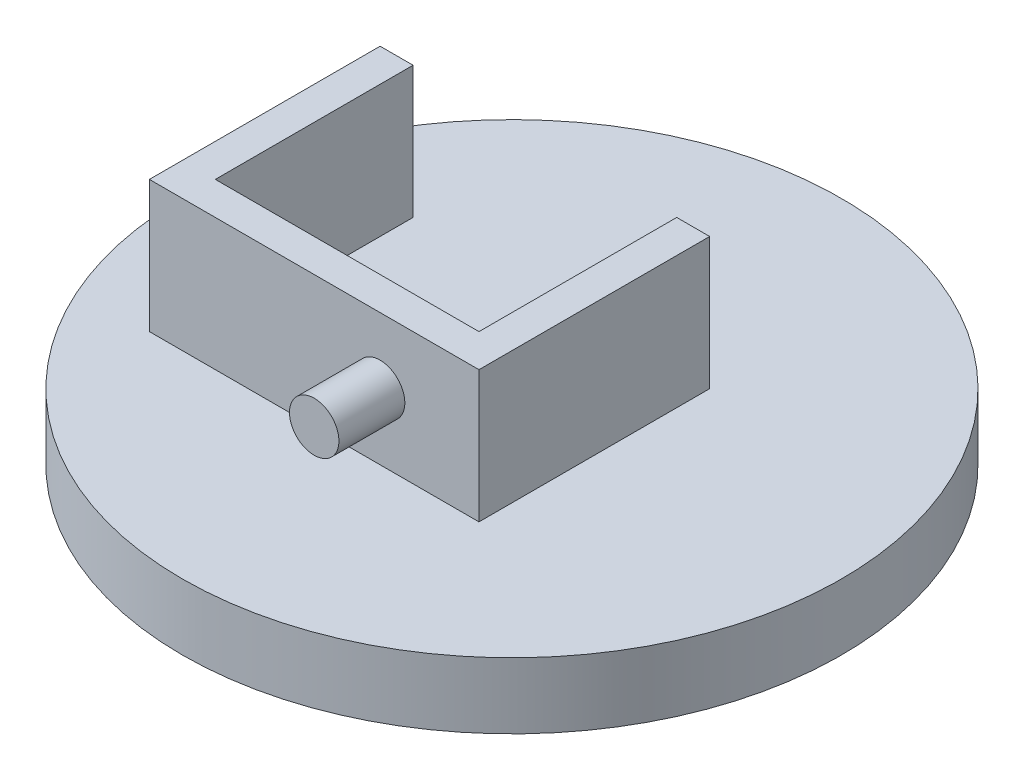
ISO-10303-21;
HEADER;
FILE_DESCRIPTION(('STEP AP214'),'2;1');
FILE_NAME('part.step','',(''),(''),'','','');
FILE_SCHEMA(('AUTOMOTIVE_DESIGN { 1 0 10303 214 1 1 1 1 }'));
ENDSEC;
DATA;
#1=APPLICATION_CONTEXT('core data for automotive mechanical design processes');
#2=APPLICATION_PROTOCOL_DEFINITION('international standard','automotive_design',2000,#1);
#3=PRODUCT_CONTEXT('',#1,'mechanical');
#4=PRODUCT('Part','Part','',(#3));
#5=PRODUCT_RELATED_PRODUCT_CATEGORY('part','',(#4));
#6=PRODUCT_DEFINITION_FORMATION('','',#4);
#7=PRODUCT_DEFINITION_CONTEXT('part definition',#1,'design');
#8=PRODUCT_DEFINITION('design','',#6,#7);
#9=PRODUCT_DEFINITION_SHAPE('','',#8);
#10=(LENGTH_UNIT() NAMED_UNIT(*) SI_UNIT(.MILLI.,.METRE.));
#11=(NAMED_UNIT(*) PLANE_ANGLE_UNIT() SI_UNIT($,.RADIAN.));
#12=(NAMED_UNIT(*) SI_UNIT($,.STERADIAN.) SOLID_ANGLE_UNIT());
#13=UNCERTAINTY_MEASURE_WITH_UNIT(LENGTH_MEASURE(1.E-05),#10,'distance_accuracy_value','');
#14=(GEOMETRIC_REPRESENTATION_CONTEXT(3) GLOBAL_UNCERTAINTY_ASSIGNED_CONTEXT((#13)) GLOBAL_UNIT_ASSIGNED_CONTEXT((#10,
#11,#12)) REPRESENTATION_CONTEXT('',''));
#15=CARTESIAN_POINT('',(0.,0.,0.));
#16=DIRECTION('',(0.,0.,1.));
#17=DIRECTION('',(1.,0.,0.));
#18=AXIS2_PLACEMENT_3D('',#15,#16,#17);
#19=CARTESIAN_POINT('',(0.,10.,0.));
#20=DIRECTION('',(0.,1.,0.));
#21=DIRECTION('',(0.,0.,1.));
#22=AXIS2_PLACEMENT_3D('',#19,#20,#21);
#23=PLANE('',#22);
#24=CARTESIAN_POINT('',(0.,10.,0.));
#25=DIRECTION('',(0.,1.,0.));
#26=DIRECTION('',(0.,0.,1.));
#27=AXIS2_PLACEMENT_3D('',#24,#25,#26);
#28=CIRCLE('',#27,5.);
#29=CARTESIAN_POINT('',(0.,10.,5.));
#30=VERTEX_POINT('',#29);
#31=EDGE_CURVE('E184',#30,#30,#28,.T.);
#32=ORIENTED_EDGE('',*,*,#31,.F.);
#33=EDGE_LOOP('',(#32));
#34=FACE_BOUND('',#33,.T.);
#35=CARTESIAN_POINT('',(0.,10.,0.));
#36=DIRECTION('',(0.,1.,0.));
#37=DIRECTION('',(0.,0.,1.));
#38=AXIS2_PLACEMENT_3D('',#35,#36,#37);
#39=CIRCLE('',#38,50.);
#40=CARTESIAN_POINT('',(0.,10.,50.));
#41=VERTEX_POINT('',#40);
#42=EDGE_CURVE('E46',#41,#41,#39,.T.);
#43=ORIENTED_EDGE('',*,*,#42,.T.);
#44=EDGE_LOOP('',(#43));
#45=FACE_BOUND('',#44,.T.);
#46=DIRECTION('',(0.,0.,1.));
#47=VECTOR('',#46,1.);
#48=CARTESIAN_POINT('',(15.,10.,-15.));
#49=LINE('',#48,#47);
#50=CARTESIAN_POINT('',(15.,10.,-15.));
#51=VERTEX_POINT('',#50);
#52=CARTESIAN_POINT('',(15.,10.,20.));
#53=VERTEX_POINT('',#52);
#54=EDGE_CURVE('E149',#51,#53,#49,.T.);
#55=ORIENTED_EDGE('',*,*,#54,.T.);
#56=DIRECTION('',(1.,0.,0.));
#57=VECTOR('',#56,1.);
#58=CARTESIAN_POINT('',(-35.,10.,20.));
#59=LINE('',#58,#57);
#60=CARTESIAN_POINT('',(-35.,10.,20.));
#61=VERTEX_POINT('',#60);
#62=EDGE_CURVE('E177',#61,#53,#59,.T.);
#63=ORIENTED_EDGE('',*,*,#62,.F.);
#64=DIRECTION('',(0.,0.,1.));
#65=VECTOR('',#64,1.);
#66=CARTESIAN_POINT('',(-35.,10.,-15.));
#67=LINE('',#66,#65);
#68=CARTESIAN_POINT('',(-35.,10.,-15.));
#69=VERTEX_POINT('',#68);
#70=EDGE_CURVE('E179',#69,#61,#67,.T.);
#71=ORIENTED_EDGE('',*,*,#70,.F.);
#72=DIRECTION('',(-1.,0.,0.));
#73=VECTOR('',#72,1.);
#74=CARTESIAN_POINT('',(-30.,10.,-15.));
#75=LINE('',#74,#73);
#76=CARTESIAN_POINT('',(-30.,10.,-15.));
#77=VERTEX_POINT('',#76);
#78=EDGE_CURVE('E169',#77,#69,#75,.T.);
#79=ORIENTED_EDGE('',*,*,#78,.F.);
#80=DIRECTION('',(0.,0.,1.));
#81=VECTOR('',#80,1.);
#82=CARTESIAN_POINT('',(-30.,10.,-15.));
#83=LINE('',#82,#81);
#84=CARTESIAN_POINT('',(-30.,10.,15.));
#85=VERTEX_POINT('',#84);
#86=EDGE_CURVE('E157',#77,#85,#83,.T.);
#87=ORIENTED_EDGE('',*,*,#86,.T.);
#88=DIRECTION('',(-1.,0.,0.));
#89=VECTOR('',#88,1.);
#90=CARTESIAN_POINT('',(10.,10.,15.));
#91=LINE('',#90,#89);
#92=CARTESIAN_POINT('',(10.,10.,15.));
#93=VERTEX_POINT('',#92);
#94=EDGE_CURVE('E139',#93,#85,#91,.T.);
#95=ORIENTED_EDGE('',*,*,#94,.F.);
#96=DIRECTION('',(0.,0.,1.));
#97=VECTOR('',#96,1.);
#98=CARTESIAN_POINT('',(9.99999999999999,10.,-15.));
#99=LINE('',#98,#97);
#100=CARTESIAN_POINT('',(9.99999999999999,10.,-15.));
#101=VERTEX_POINT('',#100);
#102=EDGE_CURVE('E154',#101,#93,#99,.T.);
#103=ORIENTED_EDGE('',*,*,#102,.F.);
#104=DIRECTION('',(1.,0.,0.));
#105=VECTOR('',#104,1.);
#106=CARTESIAN_POINT('',(9.99999999999999,10.,-15.));
#107=LINE('',#106,#105);
#108=EDGE_CURVE('E53',#101,#51,#107,.T.);
#109=ORIENTED_EDGE('',*,*,#108,.T.);
#110=EDGE_LOOP('',(#55,#63,#71,#79,#87,#95,#103,#109));
#111=FACE_BOUND('',#110,.T.);
#112=ADVANCED_FACE('F38',(#34,#45,#111),#23,.T.);
#113=CARTESIAN_POINT('',(-30.,30.,-15.));
#114=DIRECTION('',(1.,0.,0.));
#115=DIRECTION('',(0.,0.,-1.));
#116=AXIS2_PLACEMENT_3D('',#113,#114,#115);
#117=PLANE('',#116);
#118=DIRECTION('',(0.,0.,1.));
#119=VECTOR('',#118,1.);
#120=CARTESIAN_POINT('',(-30.,30.,-15.));
#121=LINE('',#120,#119);
#122=CARTESIAN_POINT('',(-30.,30.,-15.));
#123=VERTEX_POINT('',#122);
#124=CARTESIAN_POINT('',(-30.,30.,15.));
#125=VERTEX_POINT('',#124);
#126=EDGE_CURVE('E165',#123,#125,#121,.T.);
#127=ORIENTED_EDGE('',*,*,#126,.T.);
#128=DIRECTION('',(0.,1.,0.));
#129=VECTOR('',#128,1.);
#130=CARTESIAN_POINT('',(-30.,30.,15.));
#131=LINE('',#130,#129);
#132=EDGE_CURVE('E131',#85,#125,#131,.T.);
#133=ORIENTED_EDGE('',*,*,#132,.F.);
#134=ORIENTED_EDGE('',*,*,#86,.F.);
#135=DIRECTION('',(0.,-1.,0.));
#136=VECTOR('',#135,1.);
#137=CARTESIAN_POINT('',(-30.,30.,-15.));
#138=LINE('',#137,#136);
#139=EDGE_CURVE('E182',#123,#77,#138,.T.);
#140=ORIENTED_EDGE('',*,*,#139,.F.);
#141=EDGE_LOOP('',(#127,#133,#134,#140));
#142=FACE_BOUND('',#141,.T.);
#143=ADVANCED_FACE('F215',(#142),#117,.T.);
#144=CARTESIAN_POINT('',(9.99999999999999,30.,-15.));
#145=DIRECTION('',(1.,0.,0.));
#146=DIRECTION('',(0.,0.,-1.));
#147=AXIS2_PLACEMENT_3D('',#144,#145,#146);
#148=PLANE('',#147);
#149=DIRECTION('',(0.,1.,0.));
#150=VECTOR('',#149,1.);
#151=CARTESIAN_POINT('',(10.,30.,15.));
#152=LINE('',#151,#150);
#153=CARTESIAN_POINT('',(10.,30.,15.));
#154=VERTEX_POINT('',#153);
#155=EDGE_CURVE('E132',#93,#154,#152,.T.);
#156=ORIENTED_EDGE('',*,*,#155,.T.);
#157=DIRECTION('',(0.,0.,1.));
#158=VECTOR('',#157,1.);
#159=CARTESIAN_POINT('',(9.99999999999999,30.,-15.));
#160=LINE('',#159,#158);
#161=CARTESIAN_POINT('',(9.99999999999999,30.,-15.));
#162=VERTEX_POINT('',#161);
#163=EDGE_CURVE('E152',#162,#154,#160,.T.);
#164=ORIENTED_EDGE('',*,*,#163,.F.);
#165=DIRECTION('',(0.,-1.,0.));
#166=VECTOR('',#165,1.);
#167=CARTESIAN_POINT('',(9.99999999999999,30.,-15.));
#168=LINE('',#167,#166);
#169=EDGE_CURVE('E142',#162,#101,#168,.T.);
#170=ORIENTED_EDGE('',*,*,#169,.T.);
#171=ORIENTED_EDGE('',*,*,#102,.T.);
#172=EDGE_LOOP('',(#156,#164,#170,#171));
#173=FACE_BOUND('',#172,.T.);
#174=ADVANCED_FACE('F211',(#173),#148,.F.);
#175=CARTESIAN_POINT('',(0.,10.,0.));
#176=DIRECTION('',(0.,-1.,0.));
#177=DIRECTION('',(0.,0.,-1.));
#178=AXIS2_PLACEMENT_3D('',#175,#176,#177);
#179=CYLINDRICAL_SURFACE('',#178,50.);
#180=ORIENTED_EDGE('',*,*,#42,.F.);
#181=EDGE_LOOP('',(#180));
#182=FACE_BOUND('',#181,.T.);
#183=CARTESIAN_POINT('',(0.,0.,0.));
#184=DIRECTION('',(0.,1.,0.));
#185=DIRECTION('',(0.,0.,1.));
#186=AXIS2_PLACEMENT_3D('',#183,#184,#185);
#187=CIRCLE('',#186,50.);
#188=CARTESIAN_POINT('',(0.,0.,50.));
#189=VERTEX_POINT('',#188);
#190=EDGE_CURVE('E192',#189,#189,#187,.T.);
#191=ORIENTED_EDGE('',*,*,#190,.T.);
#192=EDGE_LOOP('',(#191));
#193=FACE_BOUND('',#192,.T.);
#194=ADVANCED_FACE('F40',(#182,#193),#179,.T.);
#195=CARTESIAN_POINT('',(0.,0.,0.));
#196=DIRECTION('',(0.,1.,0.));
#197=DIRECTION('',(0.,0.,1.));
#198=AXIS2_PLACEMENT_3D('',#195,#196,#197);
#199=PLANE('',#198);
#200=CARTESIAN_POINT('',(0.,0.,0.));
#201=DIRECTION('',(0.,1.,0.));
#202=DIRECTION('',(0.,0.,1.));
#203=AXIS2_PLACEMENT_3D('',#200,#201,#202);
#204=CIRCLE('',#203,5.);
#205=CARTESIAN_POINT('',(0.,0.,5.));
#206=VERTEX_POINT('',#205);
#207=EDGE_CURVE('E189',#206,#206,#204,.T.);
#208=ORIENTED_EDGE('',*,*,#207,.T.);
#209=EDGE_LOOP('',(#208));
#210=FACE_BOUND('',#209,.T.);
#211=ORIENTED_EDGE('',*,*,#190,.F.);
#212=EDGE_LOOP('',(#211));
#213=FACE_BOUND('',#212,.T.);
#214=ADVANCED_FACE('F200',(#210,#213),#199,.F.);
#215=CARTESIAN_POINT('',(0.,0.,0.));
#216=DIRECTION('',(0.,1.,0.));
#217=DIRECTION('',(0.,0.,1.));
#218=AXIS2_PLACEMENT_3D('',#215,#216,#217);
#219=CYLINDRICAL_SURFACE('',#218,5.);
#220=ORIENTED_EDGE('',*,*,#207,.F.);
#221=EDGE_LOOP('',(#220));
#222=FACE_BOUND('',#221,.T.);
#223=ORIENTED_EDGE('',*,*,#31,.T.);
#224=EDGE_LOOP('',(#223));
#225=FACE_BOUND('',#224,.T.);
#226=ADVANCED_FACE('F202',(#222,#225),#219,.F.);
#227=CARTESIAN_POINT('',(-30.,30.,-15.));
#228=DIRECTION('',(0.,0.,1.));
#229=DIRECTION('',(1.,0.,0.));
#230=AXIS2_PLACEMENT_3D('',#227,#228,#229);
#231=PLANE('',#230);
#232=ORIENTED_EDGE('',*,*,#78,.T.);
#233=DIRECTION('',(0.,-1.,0.));
#234=VECTOR('',#233,1.);
#235=CARTESIAN_POINT('',(-35.,30.,-15.));
#236=LINE('',#235,#234);
#237=CARTESIAN_POINT('',(-35.,30.,-15.));
#238=VERTEX_POINT('',#237);
#239=EDGE_CURVE('E185',#238,#69,#236,.T.);
#240=ORIENTED_EDGE('',*,*,#239,.F.);
#241=DIRECTION('',(-1.,0.,0.));
#242=VECTOR('',#241,1.);
#243=CARTESIAN_POINT('',(-30.,30.,-15.));
#244=LINE('',#243,#242);
#245=EDGE_CURVE('E173',#123,#238,#244,.T.);
#246=ORIENTED_EDGE('',*,*,#245,.F.);
#247=ORIENTED_EDGE('',*,*,#139,.T.);
#248=EDGE_LOOP('',(#232,#240,#246,#247));
#249=FACE_BOUND('',#248,.T.);
#250=ADVANCED_FACE('F208',(#249),#231,.F.);
#251=CARTESIAN_POINT('',(-35.,30.,-15.));
#252=DIRECTION('',(1.,0.,0.));
#253=DIRECTION('',(0.,0.,-1.));
#254=AXIS2_PLACEMENT_3D('',#251,#252,#253);
#255=PLANE('',#254);
#256=ORIENTED_EDGE('',*,*,#70,.T.);
#257=DIRECTION('',(0.,-1.,0.));
#258=VECTOR('',#257,1.);
#259=CARTESIAN_POINT('',(-35.,30.,20.));
#260=LINE('',#259,#258);
#261=CARTESIAN_POINT('',(-35.,30.,20.));
#262=VERTEX_POINT('',#261);
#263=EDGE_CURVE('E61',#262,#61,#260,.T.);
#264=ORIENTED_EDGE('',*,*,#263,.F.);
#265=DIRECTION('',(0.,0.,1.));
#266=VECTOR('',#265,1.);
#267=CARTESIAN_POINT('',(-35.,30.,-15.));
#268=LINE('',#267,#266);
#269=EDGE_CURVE('E171',#238,#262,#268,.T.);
#270=ORIENTED_EDGE('',*,*,#269,.F.);
#271=ORIENTED_EDGE('',*,*,#239,.T.);
#272=EDGE_LOOP('',(#256,#264,#270,#271));
#273=FACE_BOUND('',#272,.T.);
#274=ADVANCED_FACE('F229',(#273),#255,.F.);
#275=CARTESIAN_POINT('',(-35.,30.,20.));
#276=DIRECTION('',(0.,0.,-1.));
#277=DIRECTION('',(-1.,0.,0.));
#278=AXIS2_PLACEMENT_3D('',#275,#276,#277);
#279=PLANE('',#278);
#280=CARTESIAN_POINT('',(0.,20.,20.));
#281=DIRECTION('',(0.,0.,-1.));
#282=DIRECTION('',(-1.,0.,0.));
#283=AXIS2_PLACEMENT_3D('',#280,#281,#282);
#284=CIRCLE('',#283,3.75);
#285=CARTESIAN_POINT('',(-3.75,20.,20.));
#286=VERTEX_POINT('',#285);
#287=EDGE_CURVE('E11',#286,#286,#284,.F.);
#288=ORIENTED_EDGE('',*,*,#287,.F.);
#289=EDGE_LOOP('',(#288));
#290=FACE_BOUND('',#289,.T.);
#291=ORIENTED_EDGE('',*,*,#62,.T.);
#292=DIRECTION('',(0.,-1.,0.));
#293=VECTOR('',#292,1.);
#294=CARTESIAN_POINT('',(15.,30.,20.));
#295=LINE('',#294,#293);
#296=CARTESIAN_POINT('',(15.,30.,20.));
#297=VERTEX_POINT('',#296);
#298=EDGE_CURVE('E141',#297,#53,#295,.T.);
#299=ORIENTED_EDGE('',*,*,#298,.F.);
#300=DIRECTION('',(1.,0.,0.));
#301=VECTOR('',#300,1.);
#302=CARTESIAN_POINT('',(-35.,30.,20.));
#303=LINE('',#302,#301);
#304=EDGE_CURVE('E168',#262,#297,#303,.T.);
#305=ORIENTED_EDGE('',*,*,#304,.F.);
#306=ORIENTED_EDGE('',*,*,#263,.T.);
#307=EDGE_LOOP('',(#291,#299,#305,#306));
#308=FACE_BOUND('',#307,.T.);
#309=ADVANCED_FACE('F225',(#290,#308),#279,.F.);
#310=CARTESIAN_POINT('',(0.,30.,0.));
#311=DIRECTION('',(0.,1.,0.));
#312=DIRECTION('',(0.,0.,1.));
#313=AXIS2_PLACEMENT_3D('',#310,#311,#312);
#314=PLANE('',#313);
#315=ORIENTED_EDGE('',*,*,#126,.F.);
#316=ORIENTED_EDGE('',*,*,#245,.T.);
#317=ORIENTED_EDGE('',*,*,#269,.T.);
#318=ORIENTED_EDGE('',*,*,#304,.T.);
#319=DIRECTION('',(0.,0.,1.));
#320=VECTOR('',#319,1.);
#321=CARTESIAN_POINT('',(15.,30.,-15.));
#322=LINE('',#321,#320);
#323=CARTESIAN_POINT('',(15.,30.,-15.));
#324=VERTEX_POINT('',#323);
#325=EDGE_CURVE('E144',#324,#297,#322,.T.);
#326=ORIENTED_EDGE('',*,*,#325,.F.);
#327=DIRECTION('',(1.,0.,0.));
#328=VECTOR('',#327,1.);
#329=CARTESIAN_POINT('',(9.99999999999999,30.,-15.));
#330=LINE('',#329,#328);
#331=EDGE_CURVE('E160',#162,#324,#330,.T.);
#332=ORIENTED_EDGE('',*,*,#331,.F.);
#333=ORIENTED_EDGE('',*,*,#163,.T.);
#334=DIRECTION('',(-1.,0.,0.));
#335=VECTOR('',#334,1.);
#336=CARTESIAN_POINT('',(10.,30.,15.));
#337=LINE('',#336,#335);
#338=EDGE_CURVE('E135',#154,#125,#337,.T.);
#339=ORIENTED_EDGE('',*,*,#338,.T.);
#340=EDGE_LOOP('',(#315,#316,#317,#318,#326,#332,#333,#339));
#341=FACE_BOUND('',#340,.T.);
#342=ADVANCED_FACE('F228',(#341),#314,.T.);
#343=CARTESIAN_POINT('',(15.,30.,-15.));
#344=DIRECTION('',(1.,0.,0.));
#345=DIRECTION('',(0.,0.,-1.));
#346=AXIS2_PLACEMENT_3D('',#343,#344,#345);
#347=PLANE('',#346);
#348=ORIENTED_EDGE('',*,*,#54,.F.);
#349=DIRECTION('',(0.,-1.,0.));
#350=VECTOR('',#349,1.);
#351=CARTESIAN_POINT('',(15.,30.,-15.));
#352=LINE('',#351,#350);
#353=EDGE_CURVE('E145',#324,#51,#352,.T.);
#354=ORIENTED_EDGE('',*,*,#353,.F.);
#355=ORIENTED_EDGE('',*,*,#325,.T.);
#356=ORIENTED_EDGE('',*,*,#298,.T.);
#357=EDGE_LOOP('',(#348,#354,#355,#356));
#358=FACE_BOUND('',#357,.T.);
#359=ADVANCED_FACE('F239',(#358),#347,.T.);
#360=CARTESIAN_POINT('',(9.99999999999999,30.,-15.));
#361=DIRECTION('',(0.,0.,-1.));
#362=DIRECTION('',(-1.,0.,0.));
#363=AXIS2_PLACEMENT_3D('',#360,#361,#362);
#364=PLANE('',#363);
#365=CARTESIAN_POINT('',(12.5,24.8738180914245,-15.));
#366=DIRECTION('',(0.,0.,-1.));
#367=DIRECTION('',(-1.,0.,0.));
#368=AXIS2_PLACEMENT_3D('',#365,#366,#367);
#369=CIRCLE('',#368,0.999999999999989);
#370=CARTESIAN_POINT('',(11.5,24.8738180914245,-15.));
#371=VERTEX_POINT('',#370);
#372=EDGE_CURVE('E119',#371,#371,#369,.T.);
#373=ORIENTED_EDGE('',*,*,#372,.F.);
#374=EDGE_LOOP('',(#373));
#375=FACE_BOUND('',#374,.T.);
#376=CARTESIAN_POINT('',(12.5,14.8738180914245,-15.));
#377=DIRECTION('',(0.,0.,-1.));
#378=DIRECTION('',(-1.,0.,0.));
#379=AXIS2_PLACEMENT_3D('',#376,#377,#378);
#380=CIRCLE('',#379,0.999999999999989);
#381=CARTESIAN_POINT('',(11.5,14.8738180914245,-15.));
#382=VERTEX_POINT('',#381);
#383=EDGE_CURVE('E118',#382,#382,#380,.T.);
#384=ORIENTED_EDGE('',*,*,#383,.F.);
#385=EDGE_LOOP('',(#384));
#386=FACE_BOUND('',#385,.T.);
#387=ORIENTED_EDGE('',*,*,#108,.F.);
#388=ORIENTED_EDGE('',*,*,#169,.F.);
#389=ORIENTED_EDGE('',*,*,#331,.T.);
#390=ORIENTED_EDGE('',*,*,#353,.T.);
#391=EDGE_LOOP('',(#387,#388,#389,#390));
#392=FACE_BOUND('',#391,.T.);
#393=ADVANCED_FACE('F243',(#375,#386,#392),#364,.T.);
#394=CARTESIAN_POINT('',(10.,30.,15.));
#395=DIRECTION('',(0.,0.,1.));
#396=DIRECTION('',(1.,0.,0.));
#397=AXIS2_PLACEMENT_3D('',#394,#395,#396);
#398=PLANE('',#397);
#399=ORIENTED_EDGE('',*,*,#132,.T.);
#400=ORIENTED_EDGE('',*,*,#338,.F.);
#401=ORIENTED_EDGE('',*,*,#155,.F.);
#402=ORIENTED_EDGE('',*,*,#94,.T.);
#403=EDGE_LOOP('',(#399,#400,#401,#402));
#404=FACE_BOUND('',#403,.T.);
#405=ADVANCED_FACE('F247',(#404),#398,.F.);
#406=CARTESIAN_POINT('',(12.5,14.8738180914245,-5.));
#407=DIRECTION('',(0.,0.,-1.));
#408=DIRECTION('',(-1.,0.,0.));
#409=AXIS2_PLACEMENT_3D('',#406,#407,#408);
#410=CONICAL_SURFACE('',#409,0.999999999999987,1.02974425867664);
#411=CARTESIAN_POINT('',(12.5,14.8738180914245,-4.39913938097244));
#412=VERTEX_POINT('',#411);
#413=VERTEX_LOOP('',#412);
#414=FACE_BOUND('',#413,.T.);
#415=CARTESIAN_POINT('',(12.5,14.8738180914245,-5.));
#416=DIRECTION('',(0.,0.,-1.));
#417=DIRECTION('',(-1.,0.,0.));
#418=AXIS2_PLACEMENT_3D('',#415,#416,#417);
#419=CIRCLE('',#418,0.999999999999987);
#420=CARTESIAN_POINT('',(11.5,14.8738180914245,-5.));
#421=VERTEX_POINT('',#420);
#422=EDGE_CURVE('E122',#421,#421,#419,.T.);
#423=ORIENTED_EDGE('',*,*,#422,.T.);
#424=EDGE_LOOP('',(#423));
#425=FACE_BOUND('',#424,.T.);
#426=ADVANCED_FACE('F254',(#414,#425),#410,.F.);
#427=CARTESIAN_POINT('',(12.5,14.8738180914245,-15.));
#428=DIRECTION('',(0.,0.,-1.));
#429=DIRECTION('',(-1.,0.,0.));
#430=AXIS2_PLACEMENT_3D('',#427,#428,#429);
#431=CYLINDRICAL_SURFACE('',#430,0.999999999999988);
#432=ORIENTED_EDGE('',*,*,#422,.F.);
#433=EDGE_LOOP('',(#432));
#434=FACE_BOUND('',#433,.T.);
#435=ORIENTED_EDGE('',*,*,#383,.T.);
#436=EDGE_LOOP('',(#435));
#437=FACE_BOUND('',#436,.T.);
#438=ADVANCED_FACE('F112',(#434,#437),#431,.F.);
#439=CARTESIAN_POINT('',(12.5,24.8738180914245,-5.));
#440=DIRECTION('',(0.,0.,-1.));
#441=DIRECTION('',(-1.,0.,0.));
#442=AXIS2_PLACEMENT_3D('',#439,#440,#441);
#443=CONICAL_SURFACE('',#442,0.999999999999987,1.02974425867664);
#444=CARTESIAN_POINT('',(12.5,24.8738180914245,-4.39913938097244));
#445=VERTEX_POINT('',#444);
#446=VERTEX_LOOP('',#445);
#447=FACE_BOUND('',#446,.T.);
#448=CARTESIAN_POINT('',(12.5,24.8738180914245,-5.));
#449=DIRECTION('',(0.,0.,-1.));
#450=DIRECTION('',(-1.,0.,0.));
#451=AXIS2_PLACEMENT_3D('',#448,#449,#450);
#452=CIRCLE('',#451,0.999999999999987);
#453=CARTESIAN_POINT('',(11.5,24.8738180914245,-5.));
#454=VERTEX_POINT('',#453);
#455=EDGE_CURVE('E116',#454,#454,#452,.T.);
#456=ORIENTED_EDGE('',*,*,#455,.T.);
#457=EDGE_LOOP('',(#456));
#458=FACE_BOUND('',#457,.T.);
#459=ADVANCED_FACE('F108',(#447,#458),#443,.F.);
#460=CARTESIAN_POINT('',(12.5,24.8738180914245,-15.));
#461=DIRECTION('',(0.,0.,-1.));
#462=DIRECTION('',(-1.,0.,0.));
#463=AXIS2_PLACEMENT_3D('',#460,#461,#462);
#464=CYLINDRICAL_SURFACE('',#463,0.999999999999988);
#465=ORIENTED_EDGE('',*,*,#455,.F.);
#466=EDGE_LOOP('',(#465));
#467=FACE_BOUND('',#466,.T.);
#468=ORIENTED_EDGE('',*,*,#372,.T.);
#469=EDGE_LOOP('',(#468));
#470=FACE_BOUND('',#469,.T.);
#471=ADVANCED_FACE('F111',(#467,#470),#464,.F.);
#472=CARTESIAN_POINT('',(0.,20.,30.));
#473=DIRECTION('',(0.,0.,-1.));
#474=DIRECTION('',(-1.,0.,0.));
#475=AXIS2_PLACEMENT_3D('',#472,#473,#474);
#476=CYLINDRICAL_SURFACE('',#475,3.75);
#477=CARTESIAN_POINT('',(0.,20.,30.));
#478=DIRECTION('',(0.,0.,1.));
#479=DIRECTION('',(1.,0.,0.));
#480=AXIS2_PLACEMENT_3D('',#477,#478,#479);
#481=CIRCLE('',#480,3.75);
#482=CARTESIAN_POINT('',(3.75,20.,30.));
#483=VERTEX_POINT('',#482);
#484=EDGE_CURVE('E125',#483,#483,#481,.T.);
#485=ORIENTED_EDGE('',*,*,#484,.F.);
#486=EDGE_LOOP('',(#485));
#487=FACE_BOUND('',#486,.T.);
#488=ORIENTED_EDGE('',*,*,#287,.T.);
#489=EDGE_LOOP('',(#488));
#490=FACE_BOUND('',#489,.T.);
#491=ADVANCED_FACE('F264',(#487,#490),#476,.T.);
#492=CARTESIAN_POINT('',(0.,20.,30.));
#493=DIRECTION('',(0.,0.,1.));
#494=DIRECTION('',(1.,0.,0.));
#495=AXIS2_PLACEMENT_3D('',#492,#493,#494);
#496=PLANE('',#495);
#497=ORIENTED_EDGE('',*,*,#484,.T.);
#498=EDGE_LOOP('',(#497));
#499=FACE_BOUND('',#498,.T.);
#500=ADVANCED_FACE('F267',(#499),#496,.T.);
#501=CLOSED_SHELL('',(#112,#143,#174,#194,#214,#226,#250,#274,#309,#342,#359,#393,#405,#426,
#438,#459,#471,#491,#500));
#502=MANIFOLD_SOLID_BREP('B2',#501);
#503=ADVANCED_BREP_SHAPE_REPRESENTATION('',(#18,#502),#14);
#504=SHAPE_DEFINITION_REPRESENTATION(#9,#503);
ENDSEC;
END-ISO-10303-21;
